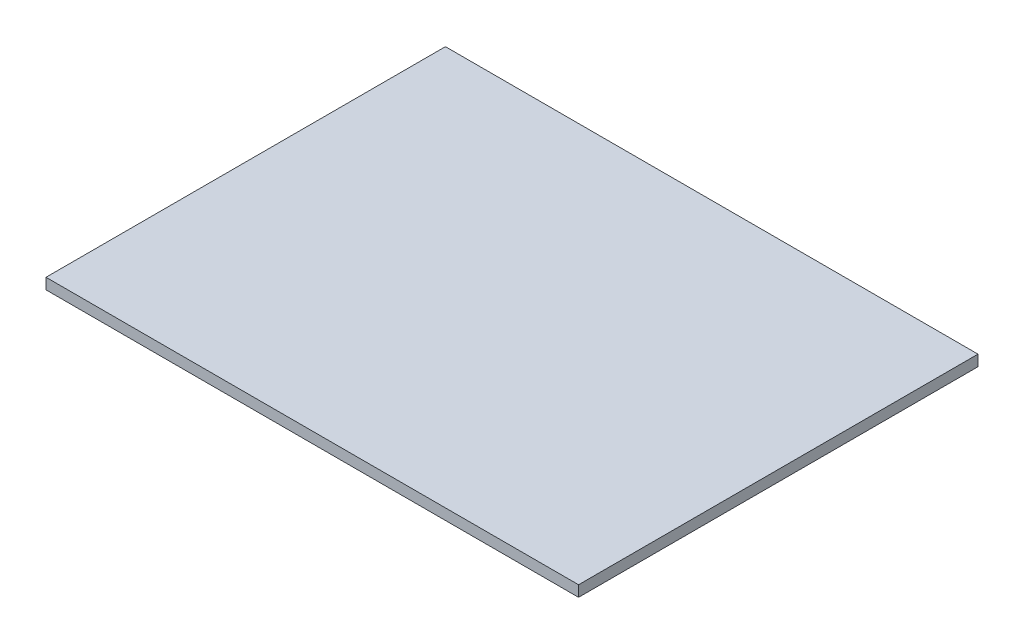
ISO-10303-21;
HEADER;
FILE_DESCRIPTION(('STEP AP214'),'2;1');
FILE_NAME('part.step','',(''),(''),'','','');
FILE_SCHEMA(('AUTOMOTIVE_DESIGN { 1 0 10303 214 1 1 1 1 }'));
ENDSEC;
DATA;
#1=APPLICATION_CONTEXT('core data for automotive mechanical design processes');
#2=APPLICATION_PROTOCOL_DEFINITION('international standard','automotive_design',2000,#1);
#3=PRODUCT_CONTEXT('',#1,'mechanical');
#4=PRODUCT('Part','Part','',(#3));
#5=PRODUCT_RELATED_PRODUCT_CATEGORY('part','',(#4));
#6=PRODUCT_DEFINITION_FORMATION('','',#4);
#7=PRODUCT_DEFINITION_CONTEXT('part definition',#1,'design');
#8=PRODUCT_DEFINITION('design','',#6,#7);
#9=PRODUCT_DEFINITION_SHAPE('','',#8);
#10=(LENGTH_UNIT() NAMED_UNIT(*) SI_UNIT(.MILLI.,.METRE.));
#11=(NAMED_UNIT(*) PLANE_ANGLE_UNIT() SI_UNIT($,.RADIAN.));
#12=(NAMED_UNIT(*) SI_UNIT($,.STERADIAN.) SOLID_ANGLE_UNIT());
#13=UNCERTAINTY_MEASURE_WITH_UNIT(LENGTH_MEASURE(1.E-05),#10,'distance_accuracy_value','');
#14=(GEOMETRIC_REPRESENTATION_CONTEXT(3) GLOBAL_UNCERTAINTY_ASSIGNED_CONTEXT((#13)) GLOBAL_UNIT_ASSIGNED_CONTEXT((#10,
#11,#12)) REPRESENTATION_CONTEXT('',''));
#15=CARTESIAN_POINT('',(0.,0.,0.));
#16=DIRECTION('',(0.,0.,1.));
#17=DIRECTION('',(1.,0.,0.));
#18=AXIS2_PLACEMENT_3D('',#15,#16,#17);
#19=CARTESIAN_POINT('',(-122.,5.,91.5));
#20=DIRECTION('',(1.,0.,0.));
#21=DIRECTION('',(0.,0.,-1.));
#22=AXIS2_PLACEMENT_3D('',#19,#20,#21);
#23=PLANE('',#22);
#24=DIRECTION('',(0.,0.,1.));
#25=VECTOR('',#24,1.);
#26=CARTESIAN_POINT('',(-122.,0.,91.5));
#27=LINE('',#26,#25);
#28=CARTESIAN_POINT('',(-122.,0.,-91.5));
#29=VERTEX_POINT('',#28);
#30=CARTESIAN_POINT('',(-122.,0.,91.5));
#31=VERTEX_POINT('',#30);
#32=EDGE_CURVE('E106',#29,#31,#27,.T.);
#33=ORIENTED_EDGE('',*,*,#32,.T.);
#34=DIRECTION('',(0.,-1.,0.));
#35=VECTOR('',#34,1.);
#36=CARTESIAN_POINT('',(-122.,5.,91.5));
#37=LINE('',#36,#35);
#38=CARTESIAN_POINT('',(-122.,5.,91.5));
#39=VERTEX_POINT('',#38);
#40=EDGE_CURVE('E11',#39,#31,#37,.T.);
#41=ORIENTED_EDGE('',*,*,#40,.F.);
#42=DIRECTION('',(0.,0.,1.));
#43=VECTOR('',#42,1.);
#44=CARTESIAN_POINT('',(-122.,5.,91.5));
#45=LINE('',#44,#43);
#46=CARTESIAN_POINT('',(-122.,5.,-91.5));
#47=VERTEX_POINT('',#46);
#48=EDGE_CURVE('E94',#47,#39,#45,.T.);
#49=ORIENTED_EDGE('',*,*,#48,.F.);
#50=DIRECTION('',(0.,-1.,0.));
#51=VECTOR('',#50,1.);
#52=CARTESIAN_POINT('',(-122.,5.,-91.5));
#53=LINE('',#52,#51);
#54=EDGE_CURVE('E102',#47,#29,#53,.T.);
#55=ORIENTED_EDGE('',*,*,#54,.T.);
#56=EDGE_LOOP('',(#33,#41,#49,#55));
#57=FACE_BOUND('',#56,.T.);
#58=ADVANCED_FACE('F43',(#57),#23,.F.);
#59=CARTESIAN_POINT('',(122.,5.,91.5));
#60=DIRECTION('',(0.,0.,-1.));
#61=DIRECTION('',(-1.,0.,0.));
#62=AXIS2_PLACEMENT_3D('',#59,#60,#61);
#63=PLANE('',#62);
#64=DIRECTION('',(1.,0.,0.));
#65=VECTOR('',#64,1.);
#66=CARTESIAN_POINT('',(122.,0.,91.5));
#67=LINE('',#66,#65);
#68=CARTESIAN_POINT('',(122.,0.,91.5));
#69=VERTEX_POINT('',#68);
#70=EDGE_CURVE('E98',#31,#69,#67,.T.);
#71=ORIENTED_EDGE('',*,*,#70,.T.);
#72=DIRECTION('',(0.,-1.,0.));
#73=VECTOR('',#72,1.);
#74=CARTESIAN_POINT('',(122.,5.,91.5));
#75=LINE('',#74,#73);
#76=CARTESIAN_POINT('',(122.,5.,91.5));
#77=VERTEX_POINT('',#76);
#78=EDGE_CURVE('E51',#77,#69,#75,.T.);
#79=ORIENTED_EDGE('',*,*,#78,.F.);
#80=DIRECTION('',(1.,0.,0.));
#81=VECTOR('',#80,1.);
#82=CARTESIAN_POINT('',(122.,5.,91.5));
#83=LINE('',#82,#81);
#84=EDGE_CURVE('E89',#39,#77,#83,.T.);
#85=ORIENTED_EDGE('',*,*,#84,.F.);
#86=ORIENTED_EDGE('',*,*,#40,.T.);
#87=EDGE_LOOP('',(#71,#79,#85,#86));
#88=FACE_BOUND('',#87,.T.);
#89=ADVANCED_FACE('F97',(#88),#63,.F.);
#90=CARTESIAN_POINT('',(122.,5.,91.5));
#91=DIRECTION('',(-1.,0.,0.));
#92=DIRECTION('',(0.,0.,1.));
#93=AXIS2_PLACEMENT_3D('',#90,#91,#92);
#94=PLANE('',#93);
#95=DIRECTION('',(0.,0.,-1.));
#96=VECTOR('',#95,1.);
#97=CARTESIAN_POINT('',(122.,0.,91.5));
#98=LINE('',#97,#96);
#99=CARTESIAN_POINT('',(122.,0.,-91.5));
#100=VERTEX_POINT('',#99);
#101=EDGE_CURVE('E76',#69,#100,#98,.T.);
#102=ORIENTED_EDGE('',*,*,#101,.T.);
#103=DIRECTION('',(0.,-1.,0.));
#104=VECTOR('',#103,1.);
#105=CARTESIAN_POINT('',(122.,5.,-91.5));
#106=LINE('',#105,#104);
#107=CARTESIAN_POINT('',(122.,5.,-91.5));
#108=VERTEX_POINT('',#107);
#109=EDGE_CURVE('E99',#108,#100,#106,.T.);
#110=ORIENTED_EDGE('',*,*,#109,.F.);
#111=DIRECTION('',(0.,0.,-1.));
#112=VECTOR('',#111,1.);
#113=CARTESIAN_POINT('',(122.,5.,91.5));
#114=LINE('',#113,#112);
#115=EDGE_CURVE('E92',#77,#108,#114,.T.);
#116=ORIENTED_EDGE('',*,*,#115,.F.);
#117=ORIENTED_EDGE('',*,*,#78,.T.);
#118=EDGE_LOOP('',(#102,#110,#116,#117));
#119=FACE_BOUND('',#118,.T.);
#120=ADVANCED_FACE('F100',(#119),#94,.F.);
#121=CARTESIAN_POINT('',(122.,5.,-91.5));
#122=DIRECTION('',(0.,0.,1.));
#123=DIRECTION('',(1.,0.,0.));
#124=AXIS2_PLACEMENT_3D('',#121,#122,#123);
#125=PLANE('',#124);
#126=DIRECTION('',(-1.,0.,0.));
#127=VECTOR('',#126,1.);
#128=CARTESIAN_POINT('',(122.,0.,-91.5));
#129=LINE('',#128,#127);
#130=EDGE_CURVE('E82',#100,#29,#129,.T.);
#131=ORIENTED_EDGE('',*,*,#130,.T.);
#132=ORIENTED_EDGE('',*,*,#54,.F.);
#133=DIRECTION('',(-1.,0.,0.));
#134=VECTOR('',#133,1.);
#135=CARTESIAN_POINT('',(122.,5.,-91.5));
#136=LINE('',#135,#134);
#137=EDGE_CURVE('E59',#108,#47,#136,.T.);
#138=ORIENTED_EDGE('',*,*,#137,.F.);
#139=ORIENTED_EDGE('',*,*,#109,.T.);
#140=EDGE_LOOP('',(#131,#132,#138,#139));
#141=FACE_BOUND('',#140,.T.);
#142=ADVANCED_FACE('F113',(#141),#125,.F.);
#143=CARTESIAN_POINT('',(0.,5.,0.));
#144=DIRECTION('',(0.,1.,0.));
#145=DIRECTION('',(0.,0.,1.));
#146=AXIS2_PLACEMENT_3D('',#143,#144,#145);
#147=PLANE('',#146);
#148=ORIENTED_EDGE('',*,*,#48,.T.);
#149=ORIENTED_EDGE('',*,*,#84,.T.);
#150=ORIENTED_EDGE('',*,*,#115,.T.);
#151=ORIENTED_EDGE('',*,*,#137,.T.);
#152=EDGE_LOOP('',(#148,#149,#150,#151));
#153=FACE_BOUND('',#152,.T.);
#154=ADVANCED_FACE('F90',(#153),#147,.T.);
#155=CARTESIAN_POINT('',(0.,0.,0.));
#156=DIRECTION('',(0.,1.,0.));
#157=DIRECTION('',(0.,0.,1.));
#158=AXIS2_PLACEMENT_3D('',#155,#156,#157);
#159=PLANE('',#158);
#160=ORIENTED_EDGE('',*,*,#32,.F.);
#161=ORIENTED_EDGE('',*,*,#130,.F.);
#162=ORIENTED_EDGE('',*,*,#101,.F.);
#163=ORIENTED_EDGE('',*,*,#70,.F.);
#164=EDGE_LOOP('',(#160,#161,#162,#163));
#165=FACE_BOUND('',#164,.T.);
#166=ADVANCED_FACE('F116',(#165),#159,.F.);
#167=CLOSED_SHELL('',(#58,#89,#120,#142,#154,#166));
#168=MANIFOLD_SOLID_BREP('B2',#167);
#169=ADVANCED_BREP_SHAPE_REPRESENTATION('',(#18,#168),#14);
#170=SHAPE_DEFINITION_REPRESENTATION(#9,#169);
ENDSEC;
END-ISO-10303-21;
